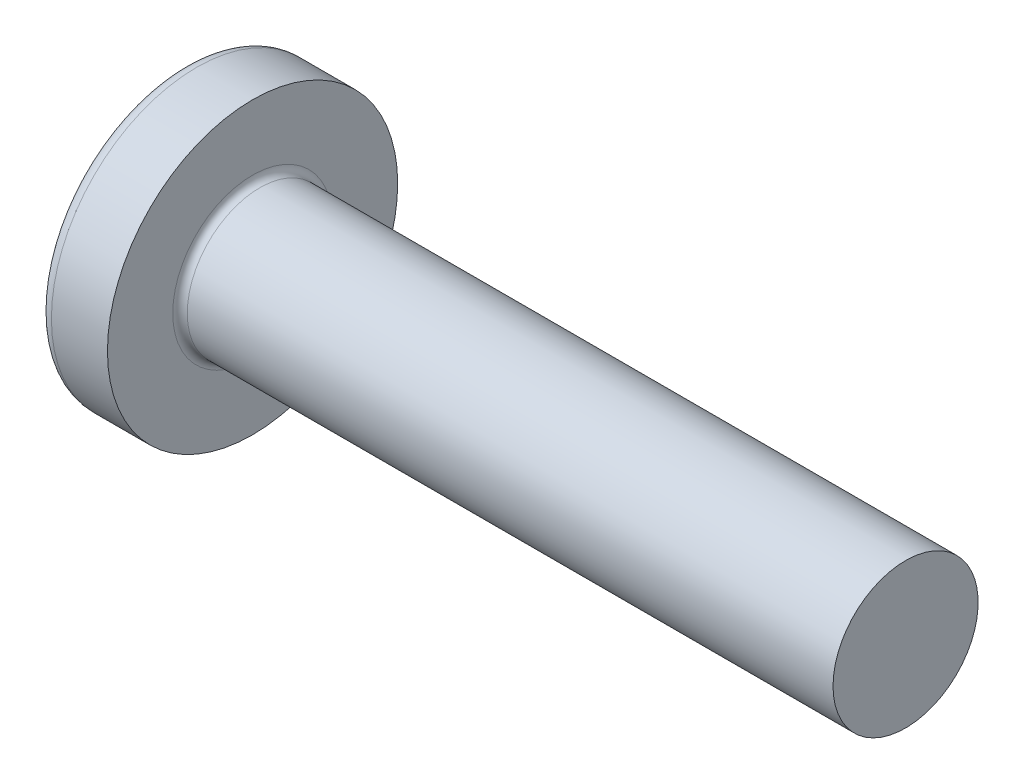
ISO-10303-21;
HEADER;
FILE_DESCRIPTION(('STEP AP214'),'2;1');
FILE_NAME('part.step','',(''),(''),'','','');
FILE_SCHEMA(('AUTOMOTIVE_DESIGN { 1 0 10303 214 1 1 1 1 }'));
ENDSEC;
DATA;
#1=APPLICATION_CONTEXT('core data for automotive mechanical design processes');
#2=APPLICATION_PROTOCOL_DEFINITION('international standard','automotive_design',2000,#1);
#3=PRODUCT_CONTEXT('',#1,'mechanical');
#4=PRODUCT('Part','Part','',(#3));
#5=PRODUCT_RELATED_PRODUCT_CATEGORY('part','',(#4));
#6=PRODUCT_DEFINITION_FORMATION('','',#4);
#7=PRODUCT_DEFINITION_CONTEXT('part definition',#1,'design');
#8=PRODUCT_DEFINITION('design','',#6,#7);
#9=PRODUCT_DEFINITION_SHAPE('','',#8);
#10=(LENGTH_UNIT() NAMED_UNIT(*) SI_UNIT(.MILLI.,.METRE.));
#11=(NAMED_UNIT(*) PLANE_ANGLE_UNIT() SI_UNIT($,.RADIAN.));
#12=(NAMED_UNIT(*) SI_UNIT($,.STERADIAN.) SOLID_ANGLE_UNIT());
#13=UNCERTAINTY_MEASURE_WITH_UNIT(LENGTH_MEASURE(1.E-05),#10,'distance_accuracy_value','');
#14=(GEOMETRIC_REPRESENTATION_CONTEXT(3) GLOBAL_UNCERTAINTY_ASSIGNED_CONTEXT((#13)) GLOBAL_UNIT_ASSIGNED_CONTEXT((#10,
#11,#12)) REPRESENTATION_CONTEXT('',''));
#15=CARTESIAN_POINT('',(0.,0.,0.));
#16=DIRECTION('',(0.,0.,1.));
#17=DIRECTION('',(1.,0.,0.));
#18=AXIS2_PLACEMENT_3D('',#15,#16,#17);
#19=CARTESIAN_POINT('',(6.5,0.,0.));
#20=DIRECTION('',(-1.,0.,0.));
#21=DIRECTION('',(0.,1.,0.));
#22=AXIS2_PLACEMENT_3D('',#19,#20,#21);
#23=SPHERICAL_SURFACE('',#22,6.5);
#24=CARTESIAN_POINT('',(1.26538895452803,0.,0.));
#25=DIRECTION('',(-1.,0.,0.));
#26=DIRECTION('',(0.,0.,1.));
#27=AXIS2_PLACEMENT_3D('',#24,#25,#26);
#28=CIRCLE('',#27,3.85342019543974);
#29=CARTESIAN_POINT('',(1.26538895452803,0.,3.85342019543974));
#30=VERTEX_POINT('',#29);
#31=EDGE_CURVE('E220',#30,#30,#28,.T.);
#32=ORIENTED_EDGE('',*,*,#31,.T.);
#33=EDGE_LOOP('',(#32));
#34=FACE_BOUND('',#33,.T.);
#35=CARTESIAN_POINT('',(0.0788099820016241,0.,0.));
#36=DIRECTION('',(1.,0.,0.));
#37=DIRECTION('',(0.,0.,-1.));
#38=AXIS2_PLACEMENT_3D('',#35,#36,#37);
#39=CIRCLE('',#38,1.0091178091571);
#40=CARTESIAN_POINT('',(0.0788099820016244,-0.514999999999996,-0.867809744562728));
#41=VERTEX_POINT('',#40);
#42=CARTESIAN_POINT('',(0.0788099820016241,-0.867809744562729,-0.515));
#43=VERTEX_POINT('',#42);
#44=EDGE_CURVE('E347',#41,#43,#39,.F.);
#45=ORIENTED_EDGE('',*,*,#44,.F.);
#46=CARTESIAN_POINT('',(6.5,-0.515000000000001,0.));
#47=DIRECTION('',(0.,1.,0.));
#48=DIRECTION('',(0.,0.,1.));
#49=AXIS2_PLACEMENT_3D('',#46,#47,#48);
#50=CIRCLE('',#49,6.47956595768575);
#51=CARTESIAN_POINT('',(0.331830520157854,-0.514999999999992,-1.98455543332603));
#52=VERTEX_POINT('',#51);
#53=EDGE_CURVE('E280',#52,#41,#50,.T.);
#54=ORIENTED_EDGE('',*,*,#53,.F.);
#55=CARTESIAN_POINT('',(6.06443225879603,0.,0.873613881878153));
#56=DIRECTION('',(0.446197753347436,0.,-0.894934391398443));
#57=DIRECTION('',(-0.894934391398442,0.,-0.446197753347436));
#58=AXIS2_PLACEMENT_3D('',#55,#56,#57);
#59=CIRCLE('',#58,6.42628038045433);
#60=CARTESIAN_POINT('',(0.331830520157856,0.515000000000007,-1.98455543332603));
#61=VERTEX_POINT('',#60);
#62=EDGE_CURVE('E254',#52,#61,#59,.T.);
#63=ORIENTED_EDGE('',*,*,#62,.T.);
#64=CARTESIAN_POINT('',(6.5,0.515,0.));
#65=DIRECTION('',(0.,-1.,0.));
#66=DIRECTION('',(0.,0.,-1.));
#67=AXIS2_PLACEMENT_3D('',#64,#65,#66);
#68=CIRCLE('',#67,6.47956595768574);
#69=CARTESIAN_POINT('',(0.0788099820016249,0.515000000000003,-0.867809744562724));
#70=VERTEX_POINT('',#69);
#71=EDGE_CURVE('E309',#70,#61,#68,.T.);
#72=ORIENTED_EDGE('',*,*,#71,.F.);
#73=CARTESIAN_POINT('',(0.0788099820016241,0.867809744562719,-0.515));
#74=VERTEX_POINT('',#73);
#75=EDGE_CURVE('E362',#74,#70,#39,.F.);
#76=ORIENTED_EDGE('',*,*,#75,.F.);
#77=CARTESIAN_POINT('',(6.5,0.,-0.515));
#78=DIRECTION('',(0.,0.,1.));
#79=DIRECTION('',(1.,0.,0.));
#80=AXIS2_PLACEMENT_3D('',#77,#78,#79);
#81=CIRCLE('',#80,6.47956595768574);
#82=CARTESIAN_POINT('',(0.331830520157856,1.98455543332603,-0.515));
#83=VERTEX_POINT('',#82);
#84=EDGE_CURVE('E248',#83,#74,#81,.T.);
#85=ORIENTED_EDGE('',*,*,#84,.F.);
#86=CARTESIAN_POINT('',(6.06443225879604,-0.873613881878154,0.));
#87=DIRECTION('',(0.446197753347436,0.894934391398443,0.));
#88=DIRECTION('',(-0.894934391398442,0.446197753347436,0.));
#89=AXIS2_PLACEMENT_3D('',#86,#87,#88);
#90=CIRCLE('',#89,6.42628038045433);
#91=CARTESIAN_POINT('',(0.331830520157857,1.98455543332603,0.515));
#92=VERTEX_POINT('',#91);
#93=EDGE_CURVE('E251',#83,#92,#90,.T.);
#94=ORIENTED_EDGE('',*,*,#93,.T.);
#95=CARTESIAN_POINT('',(6.5,0.,0.515000000000001));
#96=DIRECTION('',(0.,0.,-1.));
#97=DIRECTION('',(-1.,0.,0.));
#98=AXIS2_PLACEMENT_3D('',#95,#96,#97);
#99=CIRCLE('',#98,6.47956595768574);
#100=CARTESIAN_POINT('',(0.0788099820016241,0.867809744562719,0.514999999999999));
#101=VERTEX_POINT('',#100);
#102=EDGE_CURVE('E244',#101,#92,#99,.T.);
#103=ORIENTED_EDGE('',*,*,#102,.F.);
#104=CARTESIAN_POINT('',(0.0788099820016253,0.514999999999997,0.867809744562727));
#105=VERTEX_POINT('',#104);
#106=EDGE_CURVE('E361',#105,#101,#39,.F.);
#107=ORIENTED_EDGE('',*,*,#106,.F.);
#108=CARTESIAN_POINT('',(0.331830520157856,0.514999999999993,1.98455543332603));
#109=VERTEX_POINT('',#108);
#110=EDGE_CURVE('E264',#109,#105,#68,.T.);
#111=ORIENTED_EDGE('',*,*,#110,.F.);
#112=CARTESIAN_POINT('',(6.06443225879603,0.,-0.873613881878153));
#113=DIRECTION('',(0.446197753347436,0.,0.894934391398443));
#114=DIRECTION('',(0.894934391398442,0.,-0.446197753347436));
#115=AXIS2_PLACEMENT_3D('',#112,#113,#114);
#116=CIRCLE('',#115,6.42628038045433);
#117=CARTESIAN_POINT('',(0.331830520157855,-0.515000000000007,1.98455543332603));
#118=VERTEX_POINT('',#117);
#119=EDGE_CURVE('E53',#109,#118,#116,.T.);
#120=ORIENTED_EDGE('',*,*,#119,.T.);
#121=CARTESIAN_POINT('',(0.0788099820016247,-0.515000000000003,0.867809744562724));
#122=VERTEX_POINT('',#121);
#123=EDGE_CURVE('E261',#122,#118,#50,.T.);
#124=ORIENTED_EDGE('',*,*,#123,.F.);
#125=CARTESIAN_POINT('',(0.0788099820016241,-0.867809744562729,0.514999999999999));
#126=VERTEX_POINT('',#125);
#127=EDGE_CURVE('E397',#126,#122,#39,.F.);
#128=ORIENTED_EDGE('',*,*,#127,.F.);
#129=CARTESIAN_POINT('',(0.331830520157853,-1.98455543332603,0.514999999999999));
#130=VERTEX_POINT('',#129);
#131=EDGE_CURVE('E245',#130,#126,#99,.T.);
#132=ORIENTED_EDGE('',*,*,#131,.F.);
#133=CARTESIAN_POINT('',(6.06443225879603,0.873613881878152,0.));
#134=DIRECTION('',(0.446197753347436,-0.894934391398443,0.));
#135=DIRECTION('',(0.894934391398442,0.446197753347436,0.));
#136=AXIS2_PLACEMENT_3D('',#133,#134,#135);
#137=CIRCLE('',#136,6.42628038045433);
#138=CARTESIAN_POINT('',(0.331830520157853,-1.98455543332603,-0.515));
#139=VERTEX_POINT('',#138);
#140=EDGE_CURVE('E241',#130,#139,#137,.T.);
#141=ORIENTED_EDGE('',*,*,#140,.T.);
#142=EDGE_CURVE('E68',#43,#139,#81,.T.);
#143=ORIENTED_EDGE('',*,*,#142,.F.);
#144=EDGE_LOOP('',(#45,#54,#63,#72,#76,#85,#94,#103,#107,#111,#120,#124,#128,#132,#141,#143));
#145=FACE_BOUND('',#144,.T.);
#146=ADVANCED_FACE('F39',(#34,#145),#23,.T.);
#147=CARTESIAN_POINT('',(0.,2.15,-0.515));
#148=DIRECTION('',(0.,0.,1.));
#149=DIRECTION('',(1.,0.,0.));
#150=AXIS2_PLACEMENT_3D('',#147,#148,#149);
#151=PLANE('',#150);
#152=ORIENTED_EDGE('',*,*,#84,.T.);
#153=CARTESIAN_POINT('',(-1.51195208675156,0.994972220320188,-0.515));
#154=CARTESIAN_POINT('',(-1.20405981949279,0.970722016949958,-0.515));
#155=CARTESIAN_POINT('',(-0.896180907521174,0.946299109919651,-0.515));
#156=CARTESIAN_POINT('',(-0.280449079832185,0.896981122427851,-0.515));
#157=CARTESIAN_POINT('',(0.0274038344396873,0.872086023934883,-0.515));
#158=CARTESIAN_POINT('',(0.489146739515351,0.83429553519528,-0.515));
#159=CARTESIAN_POINT('',(0.643055047553846,0.821624058404092,-0.515));
#160=CARTESIAN_POINT('',(0.950856520197141,0.796108332639504,-0.515));
#161=CARTESIAN_POINT('',(1.10474968487868,0.783264084592465,-0.515));
#162=CARTESIAN_POINT('',(1.41251352095103,0.757376569093378,-0.515));
#163=CARTESIAN_POINT('',(1.56638419296577,0.744333309065218,-0.515));
#164=CARTESIAN_POINT('',(1.87410847343335,0.718013273188896,-0.515));
#165=CARTESIAN_POINT('',(2.02796208151372,0.704736492982792,-0.515));
#166=CARTESIAN_POINT('',(2.36455311890989,0.675386943006726,-0.515));
#167=CARTESIAN_POINT('',(2.54728562293342,0.659257575640986,-0.515));
#168=CARTESIAN_POINT('',(2.91270624109256,0.626517182479888,-0.515));
#169=CARTESIAN_POINT('',(3.09539435554038,0.609906160177238,-0.515));
#170=CARTESIAN_POINT('',(3.46069832191612,0.576073027116421,-0.515));
#171=CARTESIAN_POINT('',(3.64331417870068,0.558850968932727,-0.515));
#172=CARTESIAN_POINT('',(4.00847437496567,0.523604864540037,-0.515));
#173=CARTESIAN_POINT('',(4.19101871216888,0.505580794604253,-0.515));
#174=CARTESIAN_POINT('',(4.55606208157937,0.468429191666488,-0.515));
#175=CARTESIAN_POINT('',(4.73856107358022,0.449301262281854,-0.515));
#176=CARTESIAN_POINT('',(5.10337547353418,0.409473604748924,-0.515));
#177=CARTESIAN_POINT('',(5.28569089526422,0.388774005106069,-0.515));
#178=CARTESIAN_POINT('',(5.55897278495412,0.355828287527264,-0.515));
#179=CARTESIAN_POINT('',(5.65005277419686,0.344527918782738,-0.515));
#180=CARTESIAN_POINT('',(5.83209904103607,0.321075174263031,-0.515));
#181=CARTESIAN_POINT('',(5.92306532397915,0.308922840209686,-0.515));
#182=CARTESIAN_POINT('',(6.10486078872898,0.28342733445193,-0.515));
#183=CARTESIAN_POINT('',(6.19568992299379,0.270083817601714,-0.515));
#184=CARTESIAN_POINT('',(6.33172773785679,0.248701420809951,-0.515));
#185=CARTESIAN_POINT('',(6.37704304473344,0.241345446705304,-0.515));
#186=CARTESIAN_POINT('',(6.4675722520141,0.226018953559337,-0.515));
#187=CARTESIAN_POINT('',(6.51278614568083,0.218048394864476,-0.515));
#188=CARTESIAN_POINT('',(6.55793125759548,0.209691465274944,-0.515));
#189=B_SPLINE_CURVE_WITH_KNOTS('',3,(#153,#154,#155,#156,#157,#158,#159,#160,#161,#162,#163,
#164,#165,#166,#167,#168,#169,#170,#171,#172,#173,#174,#175,#176,#177,#178,#179,#180,#181,#182,
#183,#184,#185,#186,#187,#188),.UNSPECIFIED.,.F.,.F.,(4,2,2,2,2,2,2,2,2,2,2,2,2,2,2,2,2,4),(0.,
0.926537709781721,1.85311087258339,2.31639796016285,2.77968256468771,3.24294992902055,
3.70622594801777,4.25655436065378,4.80687878359543,5.35715597005738,5.90744944680718,
6.45794177197673,7.008389135274,7.28372117336898,7.55903973750591,7.83443833587748,
7.97216007460854,8.10989070671571),.UNSPECIFIED.);
#190=CARTESIAN_POINT('',(2.34,0.677477674908923,-0.515));
#191=VERTEX_POINT('',#190);
#192=EDGE_CURVE('E384',#74,#191,#189,.T.);
#193=ORIENTED_EDGE('',*,*,#192,.T.);
#194=DIRECTION('',(0.,1.,0.));
#195=VECTOR('',#194,1.);
#196=CARTESIAN_POINT('',(2.34,-0.983319232260742,-0.515));
#197=LINE('',#196,#195);
#198=CARTESIAN_POINT('',(2.34,0.983319232260743,-0.515));
#199=VERTEX_POINT('',#198);
#200=EDGE_CURVE('E330',#191,#199,#197,.T.);
#201=ORIENTED_EDGE('',*,*,#200,.T.);
#202=DIRECTION('',(0.894934391398442,-0.446197753347436,0.));
#203=VECTOR('',#202,1.);
#204=CARTESIAN_POINT('',(0.,2.15,-0.515));
#205=LINE('',#204,#203);
#206=EDGE_CURVE('E221',#83,#199,#205,.T.);
#207=ORIENTED_EDGE('',*,*,#206,.F.);
#208=EDGE_LOOP('',(#152,#193,#201,#207));
#209=FACE_BOUND('',#208,.T.);
#210=ADVANCED_FACE('F174',(#209),#151,.T.);
#211=CARTESIAN_POINT('',(2.34,-0.983319232260742,-0.515));
#212=VERTEX_POINT('',#211);
#213=CARTESIAN_POINT('',(2.34,-0.677477674908923,-0.515));
#214=VERTEX_POINT('',#213);
#215=EDGE_CURVE('E229',#212,#214,#197,.T.);
#216=ORIENTED_EDGE('',*,*,#215,.T.);
#217=CARTESIAN_POINT('',(-1.51195208675156,-0.994972220320188,-0.515));
#218=CARTESIAN_POINT('',(-1.20405981949279,-0.970722016949958,-0.515));
#219=CARTESIAN_POINT('',(-0.896180907521174,-0.946299109919651,-0.515));
#220=CARTESIAN_POINT('',(-0.280449079832185,-0.896981122427851,-0.515));
#221=CARTESIAN_POINT('',(0.027403834439687,-0.872086023934883,-0.515));
#222=CARTESIAN_POINT('',(0.48914673951535,-0.83429553519528,-0.515));
#223=CARTESIAN_POINT('',(0.643055047553845,-0.821624058404092,-0.515));
#224=CARTESIAN_POINT('',(0.95085652019714,-0.796108332639504,-0.515));
#225=CARTESIAN_POINT('',(1.10474968487868,-0.783264084592466,-0.515));
#226=CARTESIAN_POINT('',(1.41251352095103,-0.757376569093378,-0.515));
#227=CARTESIAN_POINT('',(1.56638419296577,-0.744333309065218,-0.515));
#228=CARTESIAN_POINT('',(1.87410847343335,-0.718013273188896,-0.515));
#229=CARTESIAN_POINT('',(2.02796208151372,-0.704736492982792,-0.515));
#230=CARTESIAN_POINT('',(2.36455311890989,-0.675386943006726,-0.515));
#231=CARTESIAN_POINT('',(2.54728562293342,-0.659257575640986,-0.515));
#232=CARTESIAN_POINT('',(2.91270624109256,-0.626517182479888,-0.515));
#233=CARTESIAN_POINT('',(3.09539435554038,-0.609906160177238,-0.515));
#234=CARTESIAN_POINT('',(3.46069832191613,-0.576073027116421,-0.515));
#235=CARTESIAN_POINT('',(3.64331417870068,-0.558850968932727,-0.515));
#236=CARTESIAN_POINT('',(4.00847437496567,-0.523604864540037,-0.515));
#237=CARTESIAN_POINT('',(4.19101871216888,-0.505580794604252,-0.515));
#238=CARTESIAN_POINT('',(4.55606208157937,-0.468429191666487,-0.515));
#239=CARTESIAN_POINT('',(4.73856107358023,-0.449301262281853,-0.515));
#240=CARTESIAN_POINT('',(5.10337547353419,-0.409473604748924,-0.515));
#241=CARTESIAN_POINT('',(5.28569089526422,-0.388774005106069,-0.515));
#242=CARTESIAN_POINT('',(5.55897278495412,-0.355828287527264,-0.515));
#243=CARTESIAN_POINT('',(5.65005277419686,-0.344527918782738,-0.515));
#244=CARTESIAN_POINT('',(5.83209904103608,-0.32107517426303,-0.515));
#245=CARTESIAN_POINT('',(5.92306532397915,-0.308922840209685,-0.515));
#246=CARTESIAN_POINT('',(6.10486078872898,-0.283427334451929,-0.515));
#247=CARTESIAN_POINT('',(6.1956899229938,-0.270083817601713,-0.515));
#248=CARTESIAN_POINT('',(6.33172773785679,-0.24870142080995,-0.515));
#249=CARTESIAN_POINT('',(6.37704304473344,-0.241345446705303,-0.515));
#250=CARTESIAN_POINT('',(6.4675722520141,-0.226018953559337,-0.515));
#251=CARTESIAN_POINT('',(6.51278614568083,-0.218048394864475,-0.515));
#252=CARTESIAN_POINT('',(6.55793125759549,-0.209691465274944,-0.515));
#253=B_SPLINE_CURVE_WITH_KNOTS('',3,(#217,#218,#219,#220,#221,#222,#223,#224,#225,#226,#227,
#228,#229,#230,#231,#232,#233,#234,#235,#236,#237,#238,#239,#240,#241,#242,#243,#244,#245,#246,
#247,#248,#249,#250,#251,#252),.UNSPECIFIED.,.F.,.F.,(4,2,2,2,2,2,2,2,2,2,2,2,2,2,2,2,2,4),(0.,
0.926537709781721,1.85311087258339,2.31639796016285,2.77968256468771,3.24294992902054,
3.70622594801777,4.25655436065378,4.80687878359543,5.35715597005738,5.90744944680718,
6.45794177197673,7.008389135274,7.28372117336899,7.55903973750591,7.83443833587749,
7.97216007460855,8.10989070671571),.UNSPECIFIED.);
#254=EDGE_CURVE('E360',#214,#43,#253,.F.);
#255=ORIENTED_EDGE('',*,*,#254,.T.);
#256=ORIENTED_EDGE('',*,*,#142,.T.);
#257=DIRECTION('',(0.894934391398442,0.446197753347436,0.));
#258=VECTOR('',#257,1.);
#259=CARTESIAN_POINT('',(0.,-2.15,-0.515));
#260=LINE('',#259,#258);
#261=EDGE_CURVE('E312',#139,#212,#260,.T.);
#262=ORIENTED_EDGE('',*,*,#261,.T.);
#263=EDGE_LOOP('',(#216,#255,#256,#262));
#264=FACE_BOUND('',#263,.T.);
#265=ADVANCED_FACE('F181',(#264),#151,.T.);
#266=CARTESIAN_POINT('',(0.,-2.15,0.514999999999999));
#267=DIRECTION('',(0.,0.,-1.));
#268=DIRECTION('',(-1.,0.,0.));
#269=AXIS2_PLACEMENT_3D('',#266,#267,#268);
#270=PLANE('',#269);
#271=DIRECTION('',(0.,-1.,0.));
#272=VECTOR('',#271,1.);
#273=CARTESIAN_POINT('',(2.34,0.983319232260742,0.515));
#274=LINE('',#273,#272);
#275=CARTESIAN_POINT('',(2.34,0.983319232260743,0.515));
#276=VERTEX_POINT('',#275);
#277=CARTESIAN_POINT('',(2.34,0.677477674908923,0.515));
#278=VERTEX_POINT('',#277);
#279=EDGE_CURVE('E320',#276,#278,#274,.T.);
#280=ORIENTED_EDGE('',*,*,#279,.T.);
#281=CARTESIAN_POINT('',(-1.51195208675156,0.994972220320188,0.514999999999999));
#282=CARTESIAN_POINT('',(-1.20405981949279,0.970722016949958,0.514999999999999));
#283=CARTESIAN_POINT('',(-0.896180907521173,0.946299109919651,0.514999999999999));
#284=CARTESIAN_POINT('',(-0.280449079832184,0.896981122427852,0.514999999999999));
#285=CARTESIAN_POINT('',(0.0274038344396879,0.872086023934883,0.514999999999999));
#286=CARTESIAN_POINT('',(0.489146739515351,0.83429553519528,0.515));
#287=CARTESIAN_POINT('',(0.643055047553846,0.821624058404092,0.515));
#288=CARTESIAN_POINT('',(0.950856520197141,0.796108332639504,0.515));
#289=CARTESIAN_POINT('',(1.10474968487868,0.783264084592466,0.515));
#290=CARTESIAN_POINT('',(1.41251352095103,0.757376569093379,0.515));
#291=CARTESIAN_POINT('',(1.56638419296577,0.744333309065218,0.515));
#292=CARTESIAN_POINT('',(1.87410847343335,0.718013273188896,0.515));
#293=CARTESIAN_POINT('',(2.02796208151372,0.704736492982792,0.515));
#294=CARTESIAN_POINT('',(2.36455311890989,0.675386943006726,0.515));
#295=CARTESIAN_POINT('',(2.54728562293342,0.659257575640986,0.515));
#296=CARTESIAN_POINT('',(2.91270624109256,0.626517182479888,0.515));
#297=CARTESIAN_POINT('',(3.09539435554038,0.609906160177238,0.515));
#298=CARTESIAN_POINT('',(3.46069832191613,0.576073027116421,0.515));
#299=CARTESIAN_POINT('',(3.64331417870068,0.558850968932727,0.515));
#300=CARTESIAN_POINT('',(4.00847437496567,0.523604864540037,0.515));
#301=CARTESIAN_POINT('',(4.19101871216888,0.505580794604252,0.515));
#302=CARTESIAN_POINT('',(4.55606208157937,0.468429191666487,0.515));
#303=CARTESIAN_POINT('',(4.73856107358023,0.449301262281853,0.515000000000001));
#304=CARTESIAN_POINT('',(5.10337547353419,0.409473604748924,0.515000000000001));
#305=CARTESIAN_POINT('',(5.28569089526422,0.388774005106069,0.515000000000001));
#306=CARTESIAN_POINT('',(5.55897278495412,0.355828287527263,0.515000000000001));
#307=CARTESIAN_POINT('',(5.65005277419686,0.344527918782737,0.515000000000001));
#308=CARTESIAN_POINT('',(5.83209904103608,0.32107517426303,0.515000000000001));
#309=CARTESIAN_POINT('',(5.92306532397915,0.308922840209685,0.515000000000001));
#310=CARTESIAN_POINT('',(6.10486078872898,0.283427334451929,0.515000000000001));
#311=CARTESIAN_POINT('',(6.1956899229938,0.270083817601713,0.515000000000001));
#312=CARTESIAN_POINT('',(6.33172773785679,0.248701420809949,0.515000000000001));
#313=CARTESIAN_POINT('',(6.37704304473344,0.241345446705302,0.515000000000001));
#314=CARTESIAN_POINT('',(6.4675722520141,0.226018953559336,0.515000000000001));
#315=CARTESIAN_POINT('',(6.51278614568083,0.218048394864474,0.515000000000001));
#316=CARTESIAN_POINT('',(6.55793125759549,0.209691465274942,0.515000000000001));
#317=B_SPLINE_CURVE_WITH_KNOTS('',3,(#281,#282,#283,#284,#285,#286,#287,#288,#289,#290,#291,
#292,#293,#294,#295,#296,#297,#298,#299,#300,#301,#302,#303,#304,#305,#306,#307,#308,#309,#310,
#311,#312,#313,#314,#315,#316),.UNSPECIFIED.,.F.,.F.,(4,2,2,2,2,2,2,2,2,2,2,2,2,2,2,2,2,4),(0.,
0.926537709781721,1.85311087258339,2.31639796016285,2.77968256468771,3.24294992902054,
3.70622594801777,4.25655436065378,4.80687878359543,5.35715597005738,5.90744944680718,
6.45794177197673,7.008389135274,7.28372117336899,7.55903973750591,7.83443833587749,
7.97216007460855,8.10989070671571),.UNSPECIFIED.);
#318=EDGE_CURVE('E285',#278,#101,#317,.F.);
#319=ORIENTED_EDGE('',*,*,#318,.T.);
#320=ORIENTED_EDGE('',*,*,#102,.T.);
#321=DIRECTION('',(0.894934391398442,-0.446197753347436,0.));
#322=VECTOR('',#321,1.);
#323=CARTESIAN_POINT('',(0.,2.15,0.515));
#324=LINE('',#323,#322);
#325=EDGE_CURVE('E226',#92,#276,#324,.T.);
#326=ORIENTED_EDGE('',*,*,#325,.T.);
#327=EDGE_LOOP('',(#280,#319,#320,#326));
#328=FACE_BOUND('',#327,.T.);
#329=ADVANCED_FACE('F380',(#328),#270,.T.);
#330=ORIENTED_EDGE('',*,*,#131,.T.);
#331=CARTESIAN_POINT('',(-1.51195208675156,-0.994972220320188,0.514999999999999));
#332=CARTESIAN_POINT('',(-1.20405981949279,-0.970722016949958,0.514999999999999));
#333=CARTESIAN_POINT('',(-0.896180907521174,-0.946299109919651,0.514999999999999));
#334=CARTESIAN_POINT('',(-0.280449079832185,-0.896981122427852,0.514999999999999));
#335=CARTESIAN_POINT('',(0.0274038344396874,-0.872086023934883,0.514999999999999));
#336=CARTESIAN_POINT('',(0.489146739515351,-0.83429553519528,0.514999999999999));
#337=CARTESIAN_POINT('',(0.643055047553846,-0.821624058404092,0.514999999999999));
#338=CARTESIAN_POINT('',(0.950856520197141,-0.796108332639504,0.514999999999999));
#339=CARTESIAN_POINT('',(1.10474968487868,-0.783264084592466,0.515));
#340=CARTESIAN_POINT('',(1.41251352095103,-0.757376569093379,0.515));
#341=CARTESIAN_POINT('',(1.56638419296577,-0.744333309065218,0.515));
#342=CARTESIAN_POINT('',(1.87410847343335,-0.718013273188896,0.515));
#343=CARTESIAN_POINT('',(2.02796208151372,-0.704736492982792,0.515));
#344=CARTESIAN_POINT('',(2.36455311890989,-0.675386943006726,0.515));
#345=CARTESIAN_POINT('',(2.54728562293342,-0.659257575640986,0.515));
#346=CARTESIAN_POINT('',(2.91270624109256,-0.626517182479888,0.515));
#347=CARTESIAN_POINT('',(3.09539435554038,-0.609906160177238,0.515));
#348=CARTESIAN_POINT('',(3.46069832191613,-0.576073027116421,0.515));
#349=CARTESIAN_POINT('',(3.64331417870068,-0.558850968932727,0.515));
#350=CARTESIAN_POINT('',(4.00847437496567,-0.523604864540037,0.515));
#351=CARTESIAN_POINT('',(4.19101871216888,-0.505580794604253,0.515));
#352=CARTESIAN_POINT('',(4.55606208157937,-0.468429191666487,0.515));
#353=CARTESIAN_POINT('',(4.73856107358022,-0.449301262281853,0.515));
#354=CARTESIAN_POINT('',(5.10337547353418,-0.409473604748924,0.515));
#355=CARTESIAN_POINT('',(5.28569089526422,-0.388774005106069,0.515));
#356=CARTESIAN_POINT('',(5.55897278495412,-0.355828287527263,0.515000000000001));
#357=CARTESIAN_POINT('',(5.65005277419686,-0.344527918782738,0.515000000000001));
#358=CARTESIAN_POINT('',(5.83209904103607,-0.32107517426303,0.515000000000001));
#359=CARTESIAN_POINT('',(5.92306532397915,-0.308922840209685,0.515000000000001));
#360=CARTESIAN_POINT('',(6.10486078872898,-0.283427334451929,0.515000000000001));
#361=CARTESIAN_POINT('',(6.19568992299379,-0.270083817601713,0.515000000000001));
#362=CARTESIAN_POINT('',(6.33172773785679,-0.24870142080995,0.515000000000001));
#363=CARTESIAN_POINT('',(6.37704304473344,-0.241345446705303,0.515000000000001));
#364=CARTESIAN_POINT('',(6.4675722520141,-0.226018953559336,0.515000000000001));
#365=CARTESIAN_POINT('',(6.51278614568083,-0.218048394864474,0.515000000000001));
#366=CARTESIAN_POINT('',(6.55793125759549,-0.209691465274943,0.515000000000001));
#367=B_SPLINE_CURVE_WITH_KNOTS('',3,(#331,#332,#333,#334,#335,#336,#337,#338,#339,#340,#341,
#342,#343,#344,#345,#346,#347,#348,#349,#350,#351,#352,#353,#354,#355,#356,#357,#358,#359,#360,
#361,#362,#363,#364,#365,#366),.UNSPECIFIED.,.F.,.F.,(4,2,2,2,2,2,2,2,2,2,2,2,2,2,2,2,2,4),(0.,
0.926537709781721,1.85311087258339,2.31639796016285,2.77968256468771,3.24294992902055,
3.70622594801777,4.25655436065378,4.80687878359543,5.35715597005738,5.90744944680718,
6.45794177197673,7.008389135274,7.28372117336899,7.55903973750591,7.83443833587748,
7.97216007460854,8.10989070671571),.UNSPECIFIED.);
#368=CARTESIAN_POINT('',(2.34,-0.677477674908923,0.515));
#369=VERTEX_POINT('',#368);
#370=EDGE_CURVE('E398',#126,#369,#367,.T.);
#371=ORIENTED_EDGE('',*,*,#370,.T.);
#372=CARTESIAN_POINT('',(2.34,-0.983319232260743,0.515));
#373=VERTEX_POINT('',#372);
#374=EDGE_CURVE('E322',#369,#373,#274,.T.);
#375=ORIENTED_EDGE('',*,*,#374,.T.);
#376=DIRECTION('',(0.894934391398443,0.446197753347436,0.));
#377=VECTOR('',#376,1.);
#378=CARTESIAN_POINT('',(0.,-2.15,0.514999999999999));
#379=LINE('',#378,#377);
#380=EDGE_CURVE('E314',#130,#373,#379,.T.);
#381=ORIENTED_EDGE('',*,*,#380,.F.);
#382=EDGE_LOOP('',(#330,#371,#375,#381));
#383=FACE_BOUND('',#382,.T.);
#384=ADVANCED_FACE('F425',(#383),#270,.T.);
#385=CARTESIAN_POINT('',(2.34,0.983319232260742,-0.515));
#386=DIRECTION('',(-1.,0.,0.));
#387=DIRECTION('',(0.,0.,1.));
#388=AXIS2_PLACEMENT_3D('',#385,#386,#387);
#389=PLANE('',#388);
#390=ORIENTED_EDGE('',*,*,#374,.F.);
#391=CARTESIAN_POINT('',(2.34,0.,0.));
#392=DIRECTION('',(-1.,0.,0.));
#393=DIRECTION('',(0.,0.,1.));
#394=AXIS2_PLACEMENT_3D('',#391,#392,#393);
#395=CIRCLE('',#394,0.851);
#396=EDGE_CURVE('E355',#214,#369,#395,.T.);
#397=ORIENTED_EDGE('',*,*,#396,.F.);
#398=ORIENTED_EDGE('',*,*,#215,.F.);
#399=DIRECTION('',(0.,0.,1.));
#400=VECTOR('',#399,1.);
#401=CARTESIAN_POINT('',(2.34,-0.983319232260742,-0.515));
#402=LINE('',#401,#400);
#403=EDGE_CURVE('E317',#212,#373,#402,.T.);
#404=ORIENTED_EDGE('',*,*,#403,.T.);
#405=EDGE_LOOP('',(#390,#397,#398,#404));
#406=FACE_BOUND('',#405,.T.);
#407=ADVANCED_FACE('F423',(#406),#389,.T.);
#408=DIRECTION('',(0.,0.,-1.));
#409=VECTOR('',#408,1.);
#410=CARTESIAN_POINT('',(2.34,-0.515000000000004,0.983319232260741));
#411=LINE('',#410,#409);
#412=CARTESIAN_POINT('',(2.34,-0.514999999999997,-0.677477674908925));
#413=VERTEX_POINT('',#412);
#414=CARTESIAN_POINT('',(2.34,-0.514999999999996,-0.983319232260744));
#415=VERTEX_POINT('',#414);
#416=EDGE_CURVE('E303',#413,#415,#411,.T.);
#417=ORIENTED_EDGE('',*,*,#416,.F.);
#418=CARTESIAN_POINT('',(2.34,0.515000000000003,-0.677477674908921));
#419=VERTEX_POINT('',#418);
#420=EDGE_CURVE('E60',#419,#413,#395,.T.);
#421=ORIENTED_EDGE('',*,*,#420,.F.);
#422=DIRECTION('',(0.,0.,1.));
#423=VECTOR('',#422,1.);
#424=CARTESIAN_POINT('',(2.34,0.515000000000004,-0.983319232260741));
#425=LINE('',#424,#423);
#426=CARTESIAN_POINT('',(2.34,0.515000000000004,-0.983319232260741));
#427=VERTEX_POINT('',#426);
#428=EDGE_CURVE('E306',#427,#419,#425,.T.);
#429=ORIENTED_EDGE('',*,*,#428,.F.);
#430=DIRECTION('',(0.,-1.,0.));
#431=VECTOR('',#430,1.);
#432=CARTESIAN_POINT('',(2.34,0.515000000000004,-0.983319232260741));
#433=LINE('',#432,#431);
#434=EDGE_CURVE('E297',#427,#415,#433,.T.);
#435=ORIENTED_EDGE('',*,*,#434,.T.);
#436=EDGE_LOOP('',(#417,#421,#429,#435));
#437=FACE_BOUND('',#436,.T.);
#438=ADVANCED_FACE('F350',(#437),#389,.T.);
#439=ORIENTED_EDGE('',*,*,#200,.F.);
#440=EDGE_CURVE('E354',#278,#191,#395,.T.);
#441=ORIENTED_EDGE('',*,*,#440,.F.);
#442=ORIENTED_EDGE('',*,*,#279,.F.);
#443=DIRECTION('',(0.,0.,-1.));
#444=VECTOR('',#443,1.);
#445=CARTESIAN_POINT('',(2.34,0.983319232260742,0.515));
#446=LINE('',#445,#444);
#447=EDGE_CURVE('E323',#276,#199,#446,.T.);
#448=ORIENTED_EDGE('',*,*,#447,.T.);
#449=EDGE_LOOP('',(#439,#441,#442,#448));
#450=FACE_BOUND('',#449,.T.);
#451=ADVANCED_FACE('F432',(#450),#389,.T.);
#452=CARTESIAN_POINT('',(2.34,0.514999999999998,0.677477674908924));
#453=VERTEX_POINT('',#452);
#454=CARTESIAN_POINT('',(2.34,0.514999999999997,0.983319232260744));
#455=VERTEX_POINT('',#454);
#456=EDGE_CURVE('E278',#453,#455,#425,.T.);
#457=ORIENTED_EDGE('',*,*,#456,.F.);
#458=CARTESIAN_POINT('',(2.34,-0.515000000000003,0.677477674908921));
#459=VERTEX_POINT('',#458);
#460=EDGE_CURVE('E358',#459,#453,#395,.T.);
#461=ORIENTED_EDGE('',*,*,#460,.F.);
#462=CARTESIAN_POINT('',(2.34,-0.515000000000004,0.983319232260741));
#463=VERTEX_POINT('',#462);
#464=EDGE_CURVE('E300',#463,#459,#411,.T.);
#465=ORIENTED_EDGE('',*,*,#464,.F.);
#466=DIRECTION('',(0.,1.,0.));
#467=VECTOR('',#466,1.);
#468=CARTESIAN_POINT('',(2.34,-0.515000000000004,0.983319232260741));
#469=LINE('',#468,#467);
#470=EDGE_CURVE('E304',#463,#455,#469,.T.);
#471=ORIENTED_EDGE('',*,*,#470,.T.);
#472=EDGE_LOOP('',(#457,#461,#465,#471));
#473=FACE_BOUND('',#472,.T.);
#474=ADVANCED_FACE('F427',(#473),#389,.T.);
#475=CARTESIAN_POINT('',(0.,0.514999999999993,2.15));
#476=DIRECTION('',(0.,-1.,0.));
#477=DIRECTION('',(1.,0.,0.));
#478=AXIS2_PLACEMENT_3D('',#475,#476,#477);
#479=PLANE('',#478);
#480=ORIENTED_EDGE('',*,*,#110,.T.);
#481=CARTESIAN_POINT('',(-1.51195208675156,0.514999999999997,0.994972220320189));
#482=CARTESIAN_POINT('',(-1.20405981949279,0.514999999999997,0.97072201694996));
#483=CARTESIAN_POINT('',(-0.896180907521173,0.514999999999997,0.946299109919652));
#484=CARTESIAN_POINT('',(-0.280449079832184,0.514999999999997,0.896981122427853));
#485=CARTESIAN_POINT('',(0.0274038344396879,0.514999999999997,0.872086023934884));
#486=CARTESIAN_POINT('',(0.489146739515351,0.514999999999997,0.834295535195282));
#487=CARTESIAN_POINT('',(0.643055047553846,0.514999999999997,0.821624058404094));
#488=CARTESIAN_POINT('',(0.950856520197141,0.514999999999997,0.796108332639506));
#489=CARTESIAN_POINT('',(1.10474968487868,0.514999999999997,0.783264084592467));
#490=CARTESIAN_POINT('',(1.41251352095103,0.514999999999997,0.75737656909338));
#491=CARTESIAN_POINT('',(1.56638419296577,0.514999999999997,0.74433330906522));
#492=CARTESIAN_POINT('',(1.87410847343335,0.514999999999998,0.718013273188897));
#493=CARTESIAN_POINT('',(2.02796208151372,0.514999999999998,0.704736492982794));
#494=CARTESIAN_POINT('',(2.36455311890989,0.514999999999998,0.675386943006728));
#495=CARTESIAN_POINT('',(2.54728562293342,0.514999999999998,0.659257575640987));
#496=CARTESIAN_POINT('',(2.91270624109256,0.514999999999998,0.626517182479889));
#497=CARTESIAN_POINT('',(3.09539435554038,0.514999999999998,0.60990616017724));
#498=CARTESIAN_POINT('',(3.46069832191613,0.514999999999998,0.576073027116423));
#499=CARTESIAN_POINT('',(3.64331417870068,0.514999999999998,0.558850968932729));
#500=CARTESIAN_POINT('',(4.00847437496567,0.514999999999998,0.523604864540039));
#501=CARTESIAN_POINT('',(4.19101871216888,0.514999999999998,0.505580794604254));
#502=CARTESIAN_POINT('',(4.55606208157937,0.514999999999999,0.468429191666489));
#503=CARTESIAN_POINT('',(4.73856107358023,0.514999999999999,0.449301262281855));
#504=CARTESIAN_POINT('',(5.10337547353419,0.514999999999999,0.409473604748926));
#505=CARTESIAN_POINT('',(5.28569089526422,0.514999999999999,0.388774005106071));
#506=CARTESIAN_POINT('',(5.55897278495412,0.514999999999999,0.355828287527265));
#507=CARTESIAN_POINT('',(5.65005277419686,0.514999999999999,0.344527918782739));
#508=CARTESIAN_POINT('',(5.83209904103608,0.514999999999999,0.321075174263032));
#509=CARTESIAN_POINT('',(5.92306532397915,0.514999999999999,0.308922840209687));
#510=CARTESIAN_POINT('',(6.10486078872898,0.514999999999999,0.283427334451931));
#511=CARTESIAN_POINT('',(6.19568992299379,0.514999999999999,0.270083817601715));
#512=CARTESIAN_POINT('',(6.33172773785679,0.514999999999999,0.248701420809952));
#513=CARTESIAN_POINT('',(6.37704304473344,0.514999999999999,0.241345446705305));
#514=CARTESIAN_POINT('',(6.4675722520141,0.514999999999999,0.226018953559339));
#515=CARTESIAN_POINT('',(6.51278614568083,0.514999999999999,0.218048394864478));
#516=CARTESIAN_POINT('',(6.55793125759549,0.515,0.209691465274946));
#517=B_SPLINE_CURVE_WITH_KNOTS('',3,(#481,#482,#483,#484,#485,#486,#487,#488,#489,#490,#491,
#492,#493,#494,#495,#496,#497,#498,#499,#500,#501,#502,#503,#504,#505,#506,#507,#508,#509,#510,
#511,#512,#513,#514,#515,#516),.UNSPECIFIED.,.F.,.F.,(4,2,2,2,2,2,2,2,2,2,2,2,2,2,2,2,2,4),(0.,
0.926537709781721,1.85311087258339,2.31639796016285,2.77968256468771,3.24294992902054,
3.70622594801777,4.25655436065378,4.80687878359543,5.35715597005738,5.90744944680718,
6.45794177197673,7.008389135274,7.28372117336899,7.55903973750591,7.83443833587748,
7.97216007460854,8.10989070671571),.UNSPECIFIED.);
#518=EDGE_CURVE('E446',#105,#453,#517,.T.);
#519=ORIENTED_EDGE('',*,*,#518,.T.);
#520=ORIENTED_EDGE('',*,*,#456,.T.);
#521=DIRECTION('',(0.894934391398442,0.,-0.446197753347436));
#522=VECTOR('',#521,1.);
#523=CARTESIAN_POINT('',(0.,0.514999999999993,2.15));
#524=LINE('',#523,#522);
#525=EDGE_CURVE('E271',#109,#455,#524,.T.);
#526=ORIENTED_EDGE('',*,*,#525,.F.);
#527=EDGE_LOOP('',(#480,#519,#520,#526));
#528=FACE_BOUND('',#527,.T.);
#529=ADVANCED_FACE('F275',(#528),#479,.T.);
#530=CARTESIAN_POINT('',(0.,-0.514999999999992,-2.15));
#531=DIRECTION('',(0.,1.,0.));
#532=DIRECTION('',(-1.,0.,0.));
#533=AXIS2_PLACEMENT_3D('',#530,#531,#532);
#534=PLANE('',#533);
#535=ORIENTED_EDGE('',*,*,#464,.T.);
#536=CARTESIAN_POINT('',(-1.51195208754037,-0.515000000000003,0.994972220382296));
#537=CARTESIAN_POINT('',(-1.20405982018868,-0.515000000000003,0.970722017005062));
#538=CARTESIAN_POINT('',(-0.896180908124144,-0.515000000000003,0.946299109967687));
#539=CARTESIAN_POINT('',(-0.280449080249313,-0.515000000000003,0.896981122461526));
#540=CARTESIAN_POINT('',(0.027403834115485,-0.515000000000003,0.872086023961263));
#541=CARTESIAN_POINT('',(0.489146739371409,-0.515000000000003,0.834295535207135));
#542=CARTESIAN_POINT('',(0.643055047497245,-0.515000000000003,0.821624058408794));
#543=CARTESIAN_POINT('',(0.950856520315204,-0.515000000000003,0.796108332629704));
#544=CARTESIAN_POINT('',(1.10474968508407,-0.515000000000003,0.783264084575316));
#545=CARTESIAN_POINT('',(1.41251352133103,-0.515000000000003,0.757376569061286));
#546=CARTESIAN_POINT('',(1.56638419343305,-0.515000000000003,0.744333309025532));
#547=CARTESIAN_POINT('',(1.87410847407519,-0.515000000000003,0.718013273133714));
#548=CARTESIAN_POINT('',(2.02796208224283,-0.515000000000002,0.704736492919708));
#549=CARTESIAN_POINT('',(2.36455311972626,-0.515000000000002,0.675386942934954));
#550=CARTESIAN_POINT('',(2.5472856237498,-0.515000000000002,0.659257575568566));
#551=CARTESIAN_POINT('',(2.91270624190895,-0.515000000000002,0.626517182406012));
#552=CARTESIAN_POINT('',(3.09539435635676,-0.515000000000002,0.609906160102553));
#553=CARTESIAN_POINT('',(3.46069832273244,-0.515000000000002,0.576073027039887));
#554=CARTESIAN_POINT('',(3.64331417951694,-0.515000000000002,0.558850968855155));
#555=CARTESIAN_POINT('',(4.00847437578178,-0.515000000000002,0.523604864460042));
#556=CARTESIAN_POINT('',(4.1910187129849,-0.515000000000002,0.505580794522874));
#557=CARTESIAN_POINT('',(4.55606208239526,-0.515000000000002,0.468429191581778));
#558=CARTESIAN_POINT('',(4.73856107439606,-0.515000000000002,0.449301262195196));
#559=CARTESIAN_POINT('',(5.10337547434977,-0.515000000000002,0.409473604657433));
#560=CARTESIAN_POINT('',(5.28569089607961,-0.515000000000002,0.388774005011692));
#561=CARTESIAN_POINT('',(5.55897278576906,-0.515000000000002,0.35582828742708));
#562=CARTESIAN_POINT('',(5.65005277501166,-0.515000000000002,0.344527918680366));
#563=CARTESIAN_POINT('',(5.83209904185046,-0.515000000000002,0.321075174155497));
#564=CARTESIAN_POINT('',(5.92306532479326,-0.515000000000002,0.308922840099178));
#565=CARTESIAN_POINT('',(6.10486078954238,-0.515000000000002,0.28342733433415));
#566=CARTESIAN_POINT('',(6.19568992380676,-0.515000000000002,0.270083817479634));
#567=CARTESIAN_POINT('',(6.33172773866873,-0.515000000000002,0.248701420679476));
#568=CARTESIAN_POINT('',(6.37704304554499,-0.515000000000002,0.241345446571704));
#569=CARTESIAN_POINT('',(6.46757225282465,-0.515000000000002,0.22601895341842));
#570=CARTESIAN_POINT('',(6.51278614649077,-0.515000000000002,0.218048394719365));
#571=CARTESIAN_POINT('',(6.55793125840465,-0.515000000000002,0.209691465124898));
#572=B_SPLINE_CURVE_WITH_KNOTS('',3,(#536,#537,#538,#539,#540,#541,#542,#543,#544,#545,#546,
#547,#548,#549,#550,#551,#552,#553,#554,#555,#556,#557,#558,#559,#560,#561,#562,#563,#564,#565,
#566,#567,#568,#569,#570,#571),.UNSPECIFIED.,.F.,.F.,(4,2,2,2,2,2,2,2,2,2,2,2,2,2,2,2,2,4),(0.,
0.926537710061278,1.85311087314258,2.31639796098494,2.77968256577269,3.24294993036838,
3.70622594962848,4.25655436226469,4.80687878520654,5.3571559716686,5.90744944841854,
6.45794177358856,7.00838913688618,7.28372117498157,7.55903973911884,7.83443833749096,
7.97216007622236,8.10989070832989),.UNSPECIFIED.);
#573=EDGE_CURVE('E390',#459,#122,#572,.F.);
#574=ORIENTED_EDGE('',*,*,#573,.T.);
#575=ORIENTED_EDGE('',*,*,#123,.T.);
#576=DIRECTION('',(0.894934391398442,0.,-0.446197753347436));
#577=VECTOR('',#576,1.);
#578=CARTESIAN_POINT('',(0.,-0.515000000000007,2.15));
#579=LINE('',#578,#577);
#580=EDGE_CURVE('E273',#118,#463,#579,.T.);
#581=ORIENTED_EDGE('',*,*,#580,.T.);
#582=EDGE_LOOP('',(#535,#574,#575,#581));
#583=FACE_BOUND('',#582,.T.);
#584=ADVANCED_FACE('F211',(#583),#534,.T.);
#585=ORIENTED_EDGE('',*,*,#428,.T.);
#586=CARTESIAN_POINT('',(-1.51195208754037,0.515000000000004,-0.994972220382296));
#587=CARTESIAN_POINT('',(-1.20405982018868,0.515000000000003,-0.970722017005062));
#588=CARTESIAN_POINT('',(-0.896180908124144,0.515000000000003,-0.946299109967687));
#589=CARTESIAN_POINT('',(-0.280449080249312,0.515000000000003,-0.896981122461525));
#590=CARTESIAN_POINT('',(0.0274038341154851,0.515000000000003,-0.872086023961263));
#591=CARTESIAN_POINT('',(0.489146739371408,0.515000000000003,-0.834295535207134));
#592=CARTESIAN_POINT('',(0.643055047497245,0.515000000000003,-0.821624058408794));
#593=CARTESIAN_POINT('',(0.950856520315203,0.515000000000003,-0.796108332629704));
#594=CARTESIAN_POINT('',(1.10474968508407,0.515000000000003,-0.783264084575316));
#595=CARTESIAN_POINT('',(1.41251352133103,0.515000000000003,-0.757376569061286));
#596=CARTESIAN_POINT('',(1.56638419343305,0.515000000000003,-0.744333309025532));
#597=CARTESIAN_POINT('',(1.87410847407519,0.515000000000003,-0.718013273133714));
#598=CARTESIAN_POINT('',(2.02796208224283,0.515000000000003,-0.704736492919708));
#599=CARTESIAN_POINT('',(2.36455311972626,0.515000000000002,-0.675386942934954));
#600=CARTESIAN_POINT('',(2.5472856237498,0.515000000000002,-0.659257575568566));
#601=CARTESIAN_POINT('',(2.91270624190895,0.515000000000002,-0.626517182406012));
#602=CARTESIAN_POINT('',(3.09539435635676,0.515000000000002,-0.609906160102552));
#603=CARTESIAN_POINT('',(3.46069832273244,0.515000000000002,-0.576073027039887));
#604=CARTESIAN_POINT('',(3.64331417951694,0.515000000000002,-0.558850968855155));
#605=CARTESIAN_POINT('',(4.00847437578178,0.515000000000002,-0.523604864460042));
#606=CARTESIAN_POINT('',(4.1910187129849,0.515000000000002,-0.505580794522874));
#607=CARTESIAN_POINT('',(4.55606208239526,0.515000000000002,-0.468429191581778));
#608=CARTESIAN_POINT('',(4.73856107439606,0.515000000000002,-0.449301262195196));
#609=CARTESIAN_POINT('',(5.10337547434977,0.515000000000002,-0.409473604657433));
#610=CARTESIAN_POINT('',(5.28569089607961,0.515000000000002,-0.388774005011693));
#611=CARTESIAN_POINT('',(5.55897278576906,0.515000000000002,-0.35582828742708));
#612=CARTESIAN_POINT('',(5.65005277501166,0.515000000000001,-0.344527918680367));
#613=CARTESIAN_POINT('',(5.83209904185046,0.515000000000001,-0.321075174155498));
#614=CARTESIAN_POINT('',(5.92306532479326,0.515000000000001,-0.308922840099179));
#615=CARTESIAN_POINT('',(6.10486078954238,0.515000000000001,-0.283427334334151));
#616=CARTESIAN_POINT('',(6.19568992380675,0.515000000000001,-0.270083817479635));
#617=CARTESIAN_POINT('',(6.33172773866873,0.515000000000001,-0.248701420679477));
#618=CARTESIAN_POINT('',(6.37704304554499,0.515000000000001,-0.241345446571705));
#619=CARTESIAN_POINT('',(6.46757225282465,0.515000000000001,-0.226018953418421));
#620=CARTESIAN_POINT('',(6.51278614649077,0.515000000000001,-0.218048394719367));
#621=CARTESIAN_POINT('',(6.55793125840465,0.515000000000001,-0.209691465124899));
#622=B_SPLINE_CURVE_WITH_KNOTS('',3,(#586,#587,#588,#589,#590,#591,#592,#593,#594,#595,#596,
#597,#598,#599,#600,#601,#602,#603,#604,#605,#606,#607,#608,#609,#610,#611,#612,#613,#614,#615,
#616,#617,#618,#619,#620,#621),.UNSPECIFIED.,.F.,.F.,(4,2,2,2,2,2,2,2,2,2,2,2,2,2,2,2,2,4),(0.,
0.926537710061278,1.85311087314258,2.31639796098494,2.77968256577269,3.24294993036838,
3.70622594962848,4.25655436226469,4.80687878520654,5.3571559716686,5.90744944841855,
6.45794177358856,7.00838913688618,7.28372117498156,7.55903973911884,7.83443833749096,
7.97216007622236,8.10989070832989),.UNSPECIFIED.);
#623=EDGE_CURVE('E339',#419,#70,#622,.F.);
#624=ORIENTED_EDGE('',*,*,#623,.T.);
#625=ORIENTED_EDGE('',*,*,#71,.T.);
#626=DIRECTION('',(0.894934391398442,0.,0.446197753347436));
#627=VECTOR('',#626,1.);
#628=CARTESIAN_POINT('',(0.,0.515000000000008,-2.15));
#629=LINE('',#628,#627);
#630=EDGE_CURVE('E282',#61,#427,#629,.T.);
#631=ORIENTED_EDGE('',*,*,#630,.T.);
#632=EDGE_LOOP('',(#585,#624,#625,#631));
#633=FACE_BOUND('',#632,.T.);
#634=ADVANCED_FACE('F209',(#633),#479,.T.);
#635=ORIENTED_EDGE('',*,*,#53,.T.);
#636=CARTESIAN_POINT('',(-1.51195208675156,-0.514999999999996,-0.99497222032019));
#637=CARTESIAN_POINT('',(-1.20405981949279,-0.514999999999996,-0.97072201694996));
#638=CARTESIAN_POINT('',(-0.896180907521174,-0.514999999999996,-0.946299109919653));
#639=CARTESIAN_POINT('',(-0.280449079832186,-0.514999999999996,-0.896981122427854));
#640=CARTESIAN_POINT('',(0.0274038344396869,-0.514999999999996,-0.872086023934885));
#641=CARTESIAN_POINT('',(0.48914673951535,-0.514999999999997,-0.834295535195282));
#642=CARTESIAN_POINT('',(0.643055047553845,-0.514999999999997,-0.821624058404094));
#643=CARTESIAN_POINT('',(0.95085652019714,-0.514999999999997,-0.796108332639506));
#644=CARTESIAN_POINT('',(1.10474968487868,-0.514999999999997,-0.783264084592468));
#645=CARTESIAN_POINT('',(1.41251352095103,-0.514999999999997,-0.757376569093381));
#646=CARTESIAN_POINT('',(1.56638419296577,-0.514999999999997,-0.74433330906522));
#647=CARTESIAN_POINT('',(1.87410847343335,-0.514999999999997,-0.718013273188898));
#648=CARTESIAN_POINT('',(2.02796208151372,-0.514999999999997,-0.704736492982794));
#649=CARTESIAN_POINT('',(2.36455311890989,-0.514999999999998,-0.675386943006728));
#650=CARTESIAN_POINT('',(2.54728562293342,-0.514999999999998,-0.659257575640988));
#651=CARTESIAN_POINT('',(2.91270624109256,-0.514999999999998,-0.62651718247989));
#652=CARTESIAN_POINT('',(3.09539435554038,-0.514999999999998,-0.60990616017724));
#653=CARTESIAN_POINT('',(3.46069832191612,-0.514999999999998,-0.576073027116423));
#654=CARTESIAN_POINT('',(3.64331417870068,-0.514999999999998,-0.558850968932729));
#655=CARTESIAN_POINT('',(4.00847437496567,-0.514999999999998,-0.523604864540039));
#656=CARTESIAN_POINT('',(4.19101871216888,-0.514999999999999,-0.505580794604254));
#657=CARTESIAN_POINT('',(4.55606208157937,-0.514999999999999,-0.468429191666489));
#658=CARTESIAN_POINT('',(4.73856107358022,-0.514999999999999,-0.449301262281855));
#659=CARTESIAN_POINT('',(5.10337547353418,-0.514999999999999,-0.409473604748926));
#660=CARTESIAN_POINT('',(5.28569089526422,-0.514999999999999,-0.388774005106071));
#661=CARTESIAN_POINT('',(5.55897278495412,-0.514999999999999,-0.355828287527265));
#662=CARTESIAN_POINT('',(5.65005277419686,-0.514999999999999,-0.34452791878274));
#663=CARTESIAN_POINT('',(5.83209904103607,-0.515,-0.321075174263032));
#664=CARTESIAN_POINT('',(5.92306532397915,-0.515,-0.308922840209687));
#665=CARTESIAN_POINT('',(6.10486078872898,-0.515,-0.283427334451931));
#666=CARTESIAN_POINT('',(6.19568992299379,-0.515,-0.270083817601715));
#667=CARTESIAN_POINT('',(6.33172773785679,-0.515,-0.248701420809951));
#668=CARTESIAN_POINT('',(6.37704304473344,-0.515,-0.241345446705304));
#669=CARTESIAN_POINT('',(6.4675722520141,-0.515,-0.226018953559338));
#670=CARTESIAN_POINT('',(6.51278614568083,-0.515,-0.218048394864476));
#671=CARTESIAN_POINT('',(6.55793125759548,-0.515,-0.209691465274945));
#672=B_SPLINE_CURVE_WITH_KNOTS('',3,(#636,#637,#638,#639,#640,#641,#642,#643,#644,#645,#646,
#647,#648,#649,#650,#651,#652,#653,#654,#655,#656,#657,#658,#659,#660,#661,#662,#663,#664,#665,
#666,#667,#668,#669,#670,#671),.UNSPECIFIED.,.F.,.F.,(4,2,2,2,2,2,2,2,2,2,2,2,2,2,2,2,2,4),(0.,
0.926537709781721,1.85311087258339,2.31639796016285,2.77968256468771,3.24294992902054,
3.70622594801777,4.25655436065378,4.80687878359543,5.35715597005738,5.90744944680718,
6.45794177197673,7.008389135274,7.28372117336899,7.55903973750591,7.83443833587749,
7.97216007460855,8.10989070671571),.UNSPECIFIED.);
#673=EDGE_CURVE('E11',#41,#413,#672,.T.);
#674=ORIENTED_EDGE('',*,*,#673,.T.);
#675=ORIENTED_EDGE('',*,*,#416,.T.);
#676=DIRECTION('',(0.894934391398443,0.,0.446197753347436));
#677=VECTOR('',#676,1.);
#678=CARTESIAN_POINT('',(0.,-0.514999999999992,-2.15));
#679=LINE('',#678,#677);
#680=EDGE_CURVE('E294',#52,#415,#679,.T.);
#681=ORIENTED_EDGE('',*,*,#680,.F.);
#682=EDGE_LOOP('',(#635,#674,#675,#681));
#683=FACE_BOUND('',#682,.T.);
#684=ADVANCED_FACE('F203',(#683),#534,.T.);
#685=CARTESIAN_POINT('',(-25.4,0.,0.));
#686=DIRECTION('',(-1.,0.,0.));
#687=DIRECTION('',(0.,0.,1.));
#688=AXIS2_PLACEMENT_3D('',#685,#686,#687);
#689=CYLINDRICAL_SURFACE('',#688,2.);
#690=CARTESIAN_POINT('',(3.3,0.,0.));
#691=DIRECTION('',(-1.,0.,0.));
#692=DIRECTION('',(0.,0.,1.));
#693=AXIS2_PLACEMENT_3D('',#690,#691,#692);
#694=CIRCLE('',#693,2.);
#695=CARTESIAN_POINT('',(3.3,0.,2.));
#696=VERTEX_POINT('',#695);
#697=EDGE_CURVE('E215',#696,#696,#694,.F.);
#698=ORIENTED_EDGE('',*,*,#697,.T.);
#699=EDGE_LOOP('',(#698));
#700=FACE_BOUND('',#699,.T.);
#701=CARTESIAN_POINT('',(21.1,0.,0.));
#702=DIRECTION('',(-1.,0.,0.));
#703=DIRECTION('',(0.,0.,1.));
#704=AXIS2_PLACEMENT_3D('',#701,#702,#703);
#705=CIRCLE('',#704,2.);
#706=CARTESIAN_POINT('',(21.1,0.,2.));
#707=VERTEX_POINT('',#706);
#708=EDGE_CURVE('E218',#707,#707,#705,.T.);
#709=ORIENTED_EDGE('',*,*,#708,.T.);
#710=EDGE_LOOP('',(#709));
#711=FACE_BOUND('',#710,.T.);
#712=ADVANCED_FACE('F200',(#700,#711),#689,.T.);
#713=CARTESIAN_POINT('',(3.1,2.,0.));
#714=DIRECTION('',(-1.,0.,0.));
#715=DIRECTION('',(0.,0.,1.));
#716=AXIS2_PLACEMENT_3D('',#713,#714,#715);
#717=PLANE('',#716);
#718=CARTESIAN_POINT('',(3.1,0.,0.));
#719=DIRECTION('',(-1.,0.,0.));
#720=DIRECTION('',(0.,0.,1.));
#721=AXIS2_PLACEMENT_3D('',#718,#719,#720);
#722=CIRCLE('',#721,2.2);
#723=CARTESIAN_POINT('',(3.1,0.,2.2));
#724=VERTEX_POINT('',#723);
#725=EDGE_CURVE('E237',#724,#724,#722,.T.);
#726=ORIENTED_EDGE('',*,*,#725,.T.);
#727=EDGE_LOOP('',(#726));
#728=FACE_BOUND('',#727,.T.);
#729=CARTESIAN_POINT('',(3.1,0.,0.));
#730=DIRECTION('',(-1.,0.,0.));
#731=DIRECTION('',(0.,0.,1.));
#732=AXIS2_PLACEMENT_3D('',#729,#730,#731);
#733=CIRCLE('',#732,4.);
#734=CARTESIAN_POINT('',(3.1,0.,4.));
#735=VERTEX_POINT('',#734);
#736=EDGE_CURVE('E234',#735,#735,#733,.T.);
#737=ORIENTED_EDGE('',*,*,#736,.F.);
#738=EDGE_LOOP('',(#737));
#739=FACE_BOUND('',#738,.T.);
#740=ADVANCED_FACE('F197',(#728,#739),#717,.F.);
#741=CARTESIAN_POINT('',(-25.4,0.,0.));
#742=DIRECTION('',(-1.,0.,0.));
#743=DIRECTION('',(0.,0.,1.));
#744=AXIS2_PLACEMENT_3D('',#741,#742,#743);
#745=CYLINDRICAL_SURFACE('',#744,4.);
#746=ORIENTED_EDGE('',*,*,#736,.T.);
#747=EDGE_LOOP('',(#746));
#748=FACE_BOUND('',#747,.T.);
#749=CARTESIAN_POINT('',(1.55530587396956,0.,0.));
#750=DIRECTION('',(-1.,0.,0.));
#751=DIRECTION('',(0.,0.,1.));
#752=AXIS2_PLACEMENT_3D('',#749,#750,#751);
#753=CIRCLE('',#752,4.);
#754=CARTESIAN_POINT('',(1.55530587396956,0.,4.));
#755=VERTEX_POINT('',#754);
#756=EDGE_CURVE('E223',#755,#755,#753,.T.);
#757=ORIENTED_EDGE('',*,*,#756,.F.);
#758=EDGE_LOOP('',(#757));
#759=FACE_BOUND('',#758,.T.);
#760=ADVANCED_FACE('F193',(#748,#759),#745,.T.);
#761=CARTESIAN_POINT('',(1.55530587396956,0.,0.));
#762=DIRECTION('',(-1.,0.,0.));
#763=DIRECTION('',(0.,0.,1.));
#764=AXIS2_PLACEMENT_3D('',#761,#762,#763);
#765=TOROIDAL_SURFACE('',#764,3.64,0.36);
#766=ORIENTED_EDGE('',*,*,#756,.T.);
#767=EDGE_LOOP('',(#766));
#768=FACE_BOUND('',#767,.T.);
#769=ORIENTED_EDGE('',*,*,#31,.F.);
#770=EDGE_LOOP('',(#769));
#771=FACE_BOUND('',#770,.T.);
#772=ADVANCED_FACE('F190',(#768,#771),#765,.T.);
#773=CARTESIAN_POINT('',(21.1,2.,0.));
#774=DIRECTION('',(1.,0.,0.));
#775=DIRECTION('',(0.,0.,-1.));
#776=AXIS2_PLACEMENT_3D('',#773,#774,#775);
#777=PLANE('',#776);
#778=ORIENTED_EDGE('',*,*,#708,.F.);
#779=EDGE_LOOP('',(#778));
#780=FACE_BOUND('',#779,.T.);
#781=ADVANCED_FACE('F188',(#780),#777,.T.);
#782=CARTESIAN_POINT('',(3.3,0.,0.));
#783=DIRECTION('',(-1.,0.,0.));
#784=DIRECTION('',(0.,0.,1.));
#785=AXIS2_PLACEMENT_3D('',#782,#783,#784);
#786=TOROIDAL_SURFACE('',#785,2.2,0.2);
#787=ORIENTED_EDGE('',*,*,#697,.F.);
#788=EDGE_LOOP('',(#787));
#789=FACE_BOUND('',#788,.T.);
#790=ORIENTED_EDGE('',*,*,#725,.F.);
#791=EDGE_LOOP('',(#790));
#792=FACE_BOUND('',#791,.T.);
#793=ADVANCED_FACE('F41',(#789,#792),#786,.F.);
#794=CARTESIAN_POINT('',(2.34,0.983319232260742,0.515));
#795=DIRECTION('',(0.446197753347436,0.894934391398443,0.));
#796=DIRECTION('',(-0.894934391398442,0.446197753347436,0.));
#797=AXIS2_PLACEMENT_3D('',#794,#795,#796);
#798=PLANE('',#797);
#799=ORIENTED_EDGE('',*,*,#206,.T.);
#800=ORIENTED_EDGE('',*,*,#447,.F.);
#801=ORIENTED_EDGE('',*,*,#325,.F.);
#802=ORIENTED_EDGE('',*,*,#93,.F.);
#803=EDGE_LOOP('',(#799,#800,#801,#802));
#804=FACE_BOUND('',#803,.T.);
#805=ADVANCED_FACE('F378',(#804),#798,.F.);
#806=CARTESIAN_POINT('',(0.,-2.15,-0.515));
#807=DIRECTION('',(0.446197753347436,-0.894934391398443,0.));
#808=DIRECTION('',(0.894934391398442,0.446197753347436,0.));
#809=AXIS2_PLACEMENT_3D('',#806,#807,#808);
#810=PLANE('',#809);
#811=ORIENTED_EDGE('',*,*,#380,.T.);
#812=ORIENTED_EDGE('',*,*,#403,.F.);
#813=ORIENTED_EDGE('',*,*,#261,.F.);
#814=ORIENTED_EDGE('',*,*,#140,.F.);
#815=EDGE_LOOP('',(#811,#812,#813,#814));
#816=FACE_BOUND('',#815,.T.);
#817=ADVANCED_FACE('F414',(#816),#810,.F.);
#818=CARTESIAN_POINT('',(2.34,-0.515000000000004,0.983319232260741));
#819=DIRECTION('',(0.446197753347436,0.,0.894934391398443));
#820=DIRECTION('',(-0.894934391398442,0.,0.446197753347436));
#821=AXIS2_PLACEMENT_3D('',#818,#819,#820);
#822=PLANE('',#821);
#823=ORIENTED_EDGE('',*,*,#525,.T.);
#824=ORIENTED_EDGE('',*,*,#470,.F.);
#825=ORIENTED_EDGE('',*,*,#580,.F.);
#826=ORIENTED_EDGE('',*,*,#119,.F.);
#827=EDGE_LOOP('',(#823,#824,#825,#826));
#828=FACE_BOUND('',#827,.T.);
#829=ADVANCED_FACE('F269',(#828),#822,.F.);
#830=CARTESIAN_POINT('',(0.,0.515000000000008,-2.15));
#831=DIRECTION('',(0.446197753347436,0.,-0.894934391398443));
#832=DIRECTION('',(0.894934391398442,0.,0.446197753347436));
#833=AXIS2_PLACEMENT_3D('',#830,#831,#832);
#834=PLANE('',#833);
#835=ORIENTED_EDGE('',*,*,#680,.T.);
#836=ORIENTED_EDGE('',*,*,#434,.F.);
#837=ORIENTED_EDGE('',*,*,#630,.F.);
#838=ORIENTED_EDGE('',*,*,#62,.F.);
#839=EDGE_LOOP('',(#835,#836,#837,#838));
#840=FACE_BOUND('',#839,.T.);
#841=ADVANCED_FACE('F342',(#840),#834,.F.);
#842=CARTESIAN_POINT('',(2.34,0.,0.));
#843=DIRECTION('',(-1.,0.,0.));
#844=DIRECTION('',(0.,0.,1.));
#845=AXIS2_PLACEMENT_3D('',#842,#843,#844);
#846=CONICAL_SURFACE('',#845,0.851,0.0698131700797659);
#847=EDGE_CURVE('E356',#453,#278,#395,.T.);
#848=ORIENTED_EDGE('',*,*,#847,.F.);
#849=ORIENTED_EDGE('',*,*,#518,.F.);
#850=ORIENTED_EDGE('',*,*,#106,.T.);
#851=ORIENTED_EDGE('',*,*,#318,.F.);
#852=EDGE_LOOP('',(#848,#849,#850,#851));
#853=FACE_BOUND('',#852,.T.);
#854=ADVANCED_FACE('F171',(#853),#846,.F.);
#855=ORIENTED_EDGE('',*,*,#127,.T.);
#856=ORIENTED_EDGE('',*,*,#573,.F.);
#857=EDGE_CURVE('E457',#369,#459,#395,.T.);
#858=ORIENTED_EDGE('',*,*,#857,.F.);
#859=ORIENTED_EDGE('',*,*,#370,.F.);
#860=EDGE_LOOP('',(#855,#856,#858,#859));
#861=FACE_BOUND('',#860,.T.);
#862=ADVANCED_FACE('F412',(#861),#846,.F.);
#863=ORIENTED_EDGE('',*,*,#75,.T.);
#864=ORIENTED_EDGE('',*,*,#623,.F.);
#865=EDGE_CURVE('E351',#191,#419,#395,.T.);
#866=ORIENTED_EDGE('',*,*,#865,.F.);
#867=ORIENTED_EDGE('',*,*,#192,.F.);
#868=EDGE_LOOP('',(#863,#864,#866,#867));
#869=FACE_BOUND('',#868,.T.);
#870=ADVANCED_FACE('F169',(#869),#846,.F.);
#871=EDGE_CURVE('E352',#413,#214,#395,.T.);
#872=ORIENTED_EDGE('',*,*,#871,.F.);
#873=ORIENTED_EDGE('',*,*,#673,.F.);
#874=ORIENTED_EDGE('',*,*,#44,.T.);
#875=ORIENTED_EDGE('',*,*,#254,.F.);
#876=EDGE_LOOP('',(#872,#873,#874,#875));
#877=FACE_BOUND('',#876,.T.);
#878=ADVANCED_FACE('F164',(#877),#846,.F.);
#879=CARTESIAN_POINT('',(2.6165066614942,0.,0.));
#880=DIRECTION('',(-1.,0.,0.));
#881=DIRECTION('',(0.,0.,1.));
#882=AXIS2_PLACEMENT_3D('',#879,#880,#881);
#883=CONICAL_SURFACE('',#882,0.,1.25663706143592);
#884=ORIENTED_EDGE('',*,*,#847,.T.);
#885=ORIENTED_EDGE('',*,*,#440,.T.);
#886=ORIENTED_EDGE('',*,*,#865,.T.);
#887=ORIENTED_EDGE('',*,*,#420,.T.);
#888=ORIENTED_EDGE('',*,*,#871,.T.);
#889=ORIENTED_EDGE('',*,*,#396,.T.);
#890=ORIENTED_EDGE('',*,*,#857,.T.);
#891=ORIENTED_EDGE('',*,*,#460,.T.);
#892=EDGE_LOOP('',(#884,#885,#886,#887,#888,#889,#890,#891));
#893=FACE_BOUND('',#892,.T.);
#894=CARTESIAN_POINT('',(2.6165066614942,0.,0.));
#895=VERTEX_POINT('',#894);
#896=VERTEX_LOOP('',#895);
#897=FACE_BOUND('',#896,.T.);
#898=ADVANCED_FACE('F162',(#893,#897),#883,.F.);
#899=CLOSED_SHELL('',(#146,#210,#265,#329,#384,#407,#438,#451,#474,#529,#584,#634,#684,#712,
#740,#760,#772,#781,#793,#805,#817,#829,#841,#854,#862,#870,#878,#898));
#900=MANIFOLD_SOLID_BREP('B2',#899);
#901=ADVANCED_BREP_SHAPE_REPRESENTATION('',(#18,#900),#14);
#902=SHAPE_DEFINITION_REPRESENTATION(#9,#901);
ENDSEC;
END-ISO-10303-21;
